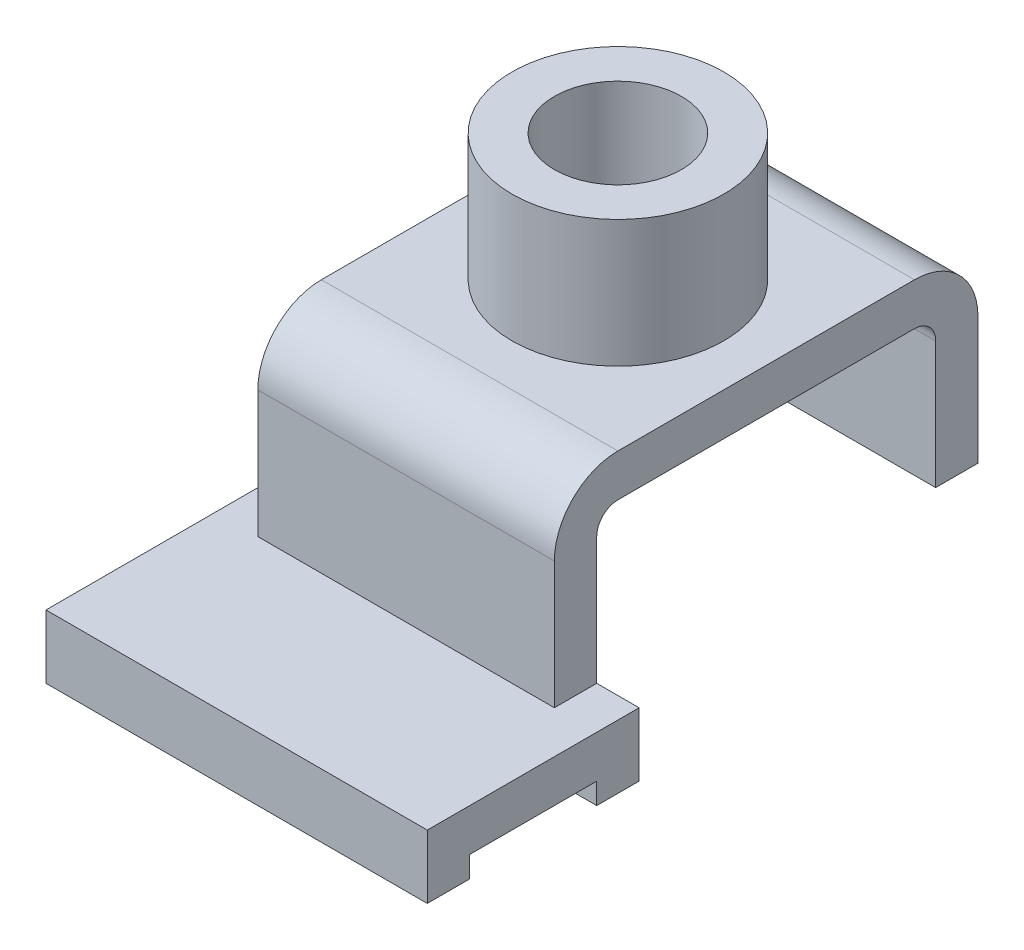
ISO-10303-21;
HEADER;
FILE_DESCRIPTION(('STEP AP214'),'2;1');
FILE_NAME('part.step','',(''),(''),'','','');
FILE_SCHEMA(('AUTOMOTIVE_DESIGN { 1 0 10303 214 1 1 1 1 }'));
ENDSEC;
DATA;
#1=APPLICATION_CONTEXT('core data for automotive mechanical design processes');
#2=APPLICATION_PROTOCOL_DEFINITION('international standard','automotive_design',2000,#1);
#3=PRODUCT_CONTEXT('',#1,'mechanical');
#4=PRODUCT('Part','Part','',(#3));
#5=PRODUCT_RELATED_PRODUCT_CATEGORY('part','',(#4));
#6=PRODUCT_DEFINITION_FORMATION('','',#4);
#7=PRODUCT_DEFINITION_CONTEXT('part definition',#1,'design');
#8=PRODUCT_DEFINITION('design','',#6,#7);
#9=PRODUCT_DEFINITION_SHAPE('','',#8);
#10=(LENGTH_UNIT() NAMED_UNIT(*) SI_UNIT(.MILLI.,.METRE.));
#11=(NAMED_UNIT(*) PLANE_ANGLE_UNIT() SI_UNIT($,.RADIAN.));
#12=(NAMED_UNIT(*) SI_UNIT($,.STERADIAN.) SOLID_ANGLE_UNIT());
#13=UNCERTAINTY_MEASURE_WITH_UNIT(LENGTH_MEASURE(1.E-05),#10,'distance_accuracy_value','');
#14=(GEOMETRIC_REPRESENTATION_CONTEXT(3) GLOBAL_UNCERTAINTY_ASSIGNED_CONTEXT((#13)) GLOBAL_UNIT_ASSIGNED_CONTEXT((#10,
#11,#12)) REPRESENTATION_CONTEXT('',''));
#15=CARTESIAN_POINT('',(0.,0.,0.));
#16=DIRECTION('',(0.,0.,1.));
#17=DIRECTION('',(1.,0.,0.));
#18=AXIS2_PLACEMENT_3D('',#15,#16,#17);
#19=CARTESIAN_POINT('',(-45.,8.35714285714285,30.6428571428572));
#20=DIRECTION('',(0.,1.,0.));
#21=DIRECTION('',(0.,0.,1.));
#22=AXIS2_PLACEMENT_3D('',#19,#20,#21);
#23=PLANE('',#22);
#24=DIRECTION('',(1.,0.,0.));
#25=VECTOR('',#24,1.);
#26=CARTESIAN_POINT('',(-35.,8.35714285714285,-9.35714285714283));
#27=LINE('',#26,#25);
#28=CARTESIAN_POINT('',(-35.,8.35714285714285,-9.35714285714283));
#29=VERTEX_POINT('',#28);
#30=CARTESIAN_POINT('',(35.,8.35714285714285,-9.35714285714283));
#31=VERTEX_POINT('',#30);
#32=EDGE_CURVE('E155',#29,#31,#27,.T.);
#33=ORIENTED_EDGE('',*,*,#32,.F.);
#34=DIRECTION('',(0.,0.,-1.));
#35=VECTOR('',#34,1.);
#36=CARTESIAN_POINT('',(-35.,8.35714285714285,-9.35714285714283));
#37=LINE('',#36,#35);
#38=CARTESIAN_POINT('',(-35.,8.35714285714285,-19.3571428571428));
#39=VERTEX_POINT('',#38);
#40=EDGE_CURVE('E298',#29,#39,#37,.T.);
#41=ORIENTED_EDGE('',*,*,#40,.T.);
#42=DIRECTION('',(1.,0.,0.));
#43=VECTOR('',#42,1.);
#44=CARTESIAN_POINT('',(-45.,8.35714285714285,-19.3571428571428));
#45=LINE('',#44,#43);
#46=CARTESIAN_POINT('',(-45.,8.35714285714285,-19.3571428571428));
#47=VERTEX_POINT('',#46);
#48=EDGE_CURVE('E131',#47,#39,#45,.T.);
#49=ORIENTED_EDGE('',*,*,#48,.F.);
#50=DIRECTION('',(0.,0.,1.));
#51=VECTOR('',#50,1.);
#52=CARTESIAN_POINT('',(-45.,8.35714285714285,30.6428571428572));
#53=LINE('',#52,#51);
#54=CARTESIAN_POINT('',(-45.,8.35714285714285,30.6428571428572));
#55=VERTEX_POINT('',#54);
#56=EDGE_CURVE('E137',#47,#55,#53,.T.);
#57=ORIENTED_EDGE('',*,*,#56,.T.);
#58=DIRECTION('',(1.,0.,0.));
#59=VECTOR('',#58,1.);
#60=CARTESIAN_POINT('',(-45.,8.35714285714285,30.6428571428572));
#61=LINE('',#60,#59);
#62=CARTESIAN_POINT('',(45.,8.35714285714285,30.6428571428572));
#63=VERTEX_POINT('',#62);
#64=EDGE_CURVE('E119',#55,#63,#61,.T.);
#65=ORIENTED_EDGE('',*,*,#64,.T.);
#66=DIRECTION('',(0.,0.,1.));
#67=VECTOR('',#66,1.);
#68=CARTESIAN_POINT('',(45.,8.35714285714285,30.6428571428572));
#69=LINE('',#68,#67);
#70=CARTESIAN_POINT('',(45.,8.35714285714285,-19.3571428571428));
#71=VERTEX_POINT('',#70);
#72=EDGE_CURVE('E167',#71,#63,#69,.T.);
#73=ORIENTED_EDGE('',*,*,#72,.F.);
#74=CARTESIAN_POINT('',(35.,8.35714285714285,-19.3571428571428));
#75=VERTEX_POINT('',#74);
#76=EDGE_CURVE('E177',#75,#71,#45,.T.);
#77=ORIENTED_EDGE('',*,*,#76,.F.);
#78=DIRECTION('',(0.,0.,-1.));
#79=VECTOR('',#78,1.);
#80=CARTESIAN_POINT('',(35.,8.35714285714285,-9.35714285714283));
#81=LINE('',#80,#79);
#82=EDGE_CURVE('E52',#31,#75,#81,.T.);
#83=ORIENTED_EDGE('',*,*,#82,.F.);
#84=EDGE_LOOP('',(#33,#41,#49,#57,#65,#73,#77,#83));
#85=FACE_BOUND('',#84,.T.);
#86=ADVANCED_FACE('F37',(#85),#23,.T.);
#87=CARTESIAN_POINT('',(-45.,-1.64285714285714,20.6428571428572));
#88=DIRECTION('',(0.,0.,-1.));
#89=DIRECTION('',(0.,1.,0.));
#90=AXIS2_PLACEMENT_3D('',#87,#88,#89);
#91=PLANE('',#90);
#92=DIRECTION('',(0.,1.,0.));
#93=VECTOR('',#92,1.);
#94=CARTESIAN_POINT('',(45.,-1.64285714285714,20.6428571428572));
#95=LINE('',#94,#93);
#96=CARTESIAN_POINT('',(45.,-6.64285714285714,20.6428571428572));
#97=VERTEX_POINT('',#96);
#98=CARTESIAN_POINT('',(45.,-1.64285714285714,20.6428571428572));
#99=VERTEX_POINT('',#98);
#100=EDGE_CURVE('E151',#97,#99,#95,.T.);
#101=ORIENTED_EDGE('',*,*,#100,.F.);
#102=DIRECTION('',(1.,0.,0.));
#103=VECTOR('',#102,1.);
#104=CARTESIAN_POINT('',(-45.,-6.64285714285714,20.6428571428572));
#105=LINE('',#104,#103);
#106=CARTESIAN_POINT('',(-45.,-6.64285714285714,20.6428571428572));
#107=VERTEX_POINT('',#106);
#108=EDGE_CURVE('E45',#107,#97,#105,.T.);
#109=ORIENTED_EDGE('',*,*,#108,.F.);
#110=DIRECTION('',(0.,1.,0.));
#111=VECTOR('',#110,1.);
#112=CARTESIAN_POINT('',(-45.,-1.64285714285714,20.6428571428572));
#113=LINE('',#112,#111);
#114=CARTESIAN_POINT('',(-45.,-1.64285714285714,20.6428571428572));
#115=VERTEX_POINT('',#114);
#116=EDGE_CURVE('E173',#107,#115,#113,.T.);
#117=ORIENTED_EDGE('',*,*,#116,.T.);
#118=DIRECTION('',(1.,0.,0.));
#119=VECTOR('',#118,1.);
#120=CARTESIAN_POINT('',(-45.,-1.64285714285714,20.6428571428572));
#121=LINE('',#120,#119);
#122=EDGE_CURVE('E99',#115,#99,#121,.T.);
#123=ORIENTED_EDGE('',*,*,#122,.T.);
#124=EDGE_LOOP('',(#101,#109,#117,#123));
#125=FACE_BOUND('',#124,.T.);
#126=ADVANCED_FACE('F39',(#125),#91,.T.);
#127=CARTESIAN_POINT('',(-45.,-6.64285714285714,20.6428571428572));
#128=DIRECTION('',(0.,-1.,0.));
#129=DIRECTION('',(0.,0.,-1.));
#130=AXIS2_PLACEMENT_3D('',#127,#128,#129);
#131=PLANE('',#130);
#132=DIRECTION('',(0.,0.,-1.));
#133=VECTOR('',#132,1.);
#134=CARTESIAN_POINT('',(45.,-6.64285714285714,20.6428571428572));
#135=LINE('',#134,#133);
#136=CARTESIAN_POINT('',(45.,-6.64285714285714,30.6428571428572));
#137=VERTEX_POINT('',#136);
#138=EDGE_CURVE('E170',#137,#97,#135,.T.);
#139=ORIENTED_EDGE('',*,*,#138,.F.);
#140=DIRECTION('',(1.,0.,0.));
#141=VECTOR('',#140,1.);
#142=CARTESIAN_POINT('',(-45.,-6.64285714285714,30.6428571428572));
#143=LINE('',#142,#141);
#144=CARTESIAN_POINT('',(-45.,-6.64285714285714,30.6428571428572));
#145=VERTEX_POINT('',#144);
#146=EDGE_CURVE('E130',#145,#137,#143,.T.);
#147=ORIENTED_EDGE('',*,*,#146,.F.);
#148=DIRECTION('',(0.,0.,-1.));
#149=VECTOR('',#148,1.);
#150=CARTESIAN_POINT('',(-45.,-6.64285714285714,20.6428571428572));
#151=LINE('',#150,#149);
#152=EDGE_CURVE('E139',#145,#107,#151,.T.);
#153=ORIENTED_EDGE('',*,*,#152,.T.);
#154=ORIENTED_EDGE('',*,*,#108,.T.);
#155=EDGE_LOOP('',(#139,#147,#153,#154));
#156=FACE_BOUND('',#155,.T.);
#157=ADVANCED_FACE('F187',(#156),#131,.T.);
#158=CARTESIAN_POINT('',(-45.,-6.64285714285714,30.6428571428572));
#159=DIRECTION('',(0.,0.,1.));
#160=DIRECTION('',(1.,0.,0.));
#161=AXIS2_PLACEMENT_3D('',#158,#159,#160);
#162=PLANE('',#161);
#163=DIRECTION('',(0.,-1.,0.));
#164=VECTOR('',#163,1.);
#165=CARTESIAN_POINT('',(45.,-6.64285714285714,30.6428571428572));
#166=LINE('',#165,#164);
#167=EDGE_CURVE('E125',#63,#137,#166,.T.);
#168=ORIENTED_EDGE('',*,*,#167,.F.);
#169=ORIENTED_EDGE('',*,*,#64,.F.);
#170=DIRECTION('',(0.,-1.,0.));
#171=VECTOR('',#170,1.);
#172=CARTESIAN_POINT('',(-45.,-6.64285714285714,30.6428571428572));
#173=LINE('',#172,#171);
#174=EDGE_CURVE('E122',#55,#145,#173,.T.);
#175=ORIENTED_EDGE('',*,*,#174,.T.);
#176=ORIENTED_EDGE('',*,*,#146,.T.);
#177=EDGE_LOOP('',(#168,#169,#175,#176));
#178=FACE_BOUND('',#177,.T.);
#179=ADVANCED_FACE('F121',(#178),#162,.T.);
#180=CARTESIAN_POINT('',(-45.,8.35714285714285,-19.3571428571428));
#181=DIRECTION('',(0.,0.,-1.));
#182=DIRECTION('',(0.,1.,0.));
#183=AXIS2_PLACEMENT_3D('',#180,#181,#182);
#184=PLANE('',#183);
#185=DIRECTION('',(0.,1.,0.));
#186=VECTOR('',#185,1.);
#187=CARTESIAN_POINT('',(45.,8.35714285714285,-19.3571428571428));
#188=LINE('',#187,#186);
#189=CARTESIAN_POINT('',(45.,-6.64285714285714,-19.3571428571428));
#190=VERTEX_POINT('',#189);
#191=EDGE_CURVE('E164',#190,#71,#188,.T.);
#192=ORIENTED_EDGE('',*,*,#191,.F.);
#193=DIRECTION('',(1.,0.,0.));
#194=VECTOR('',#193,1.);
#195=CARTESIAN_POINT('',(-45.,-6.64285714285714,-19.3571428571428));
#196=LINE('',#195,#194);
#197=CARTESIAN_POINT('',(-45.,-6.64285714285714,-19.3571428571428));
#198=VERTEX_POINT('',#197);
#199=EDGE_CURVE('E178',#198,#190,#196,.T.);
#200=ORIENTED_EDGE('',*,*,#199,.F.);
#201=DIRECTION('',(0.,1.,0.));
#202=VECTOR('',#201,1.);
#203=CARTESIAN_POINT('',(-45.,8.35714285714285,-19.3571428571428));
#204=LINE('',#203,#202);
#205=EDGE_CURVE('E144',#198,#47,#204,.T.);
#206=ORIENTED_EDGE('',*,*,#205,.T.);
#207=ORIENTED_EDGE('',*,*,#48,.T.);
#208=DIRECTION('',(0.,1.,0.));
#209=VECTOR('',#208,1.);
#210=CARTESIAN_POINT('',(-35.,8.35714285714285,-19.3571428571428));
#211=LINE('',#210,#209);
#212=CARTESIAN_POINT('',(-35.,38.3571428571429,-19.3571428571428));
#213=VERTEX_POINT('',#212);
#214=EDGE_CURVE('E300',#39,#213,#211,.T.);
#215=ORIENTED_EDGE('',*,*,#214,.T.);
#216=DIRECTION('',(1.,0.,0.));
#217=VECTOR('',#216,1.);
#218=CARTESIAN_POINT('',(-35.,38.3571428571429,-19.3571428571428));
#219=LINE('',#218,#217);
#220=CARTESIAN_POINT('',(35.,38.3571428571429,-19.3571428571428));
#221=VERTEX_POINT('',#220);
#222=EDGE_CURVE('E334',#213,#221,#219,.T.);
#223=ORIENTED_EDGE('',*,*,#222,.T.);
#224=DIRECTION('',(0.,1.,0.));
#225=VECTOR('',#224,1.);
#226=CARTESIAN_POINT('',(35.,8.35714285714285,-19.3571428571428));
#227=LINE('',#226,#225);
#228=EDGE_CURVE('E336',#75,#221,#227,.T.);
#229=ORIENTED_EDGE('',*,*,#228,.F.);
#230=ORIENTED_EDGE('',*,*,#76,.T.);
#231=EDGE_LOOP('',(#192,#200,#206,#207,#215,#223,#229,#230));
#232=FACE_BOUND('',#231,.T.);
#233=ADVANCED_FACE('F194',(#232),#184,.T.);
#234=CARTESIAN_POINT('',(-45.,-6.64285714285714,-19.3571428571428));
#235=DIRECTION('',(0.,-1.,0.));
#236=DIRECTION('',(0.,0.,-1.));
#237=AXIS2_PLACEMENT_3D('',#234,#235,#236);
#238=PLANE('',#237);
#239=DIRECTION('',(0.,0.,-1.));
#240=VECTOR('',#239,1.);
#241=CARTESIAN_POINT('',(45.,-6.64285714285714,-19.3571428571428));
#242=LINE('',#241,#240);
#243=CARTESIAN_POINT('',(45.,-6.64285714285714,-9.35714285714283));
#244=VERTEX_POINT('',#243);
#245=EDGE_CURVE('E161',#244,#190,#242,.T.);
#246=ORIENTED_EDGE('',*,*,#245,.F.);
#247=DIRECTION('',(1.,0.,0.));
#248=VECTOR('',#247,1.);
#249=CARTESIAN_POINT('',(-45.,-6.64285714285714,-9.35714285714283));
#250=LINE('',#249,#248);
#251=CARTESIAN_POINT('',(-45.,-6.64285714285714,-9.35714285714283));
#252=VERTEX_POINT('',#251);
#253=EDGE_CURVE('E180',#252,#244,#250,.T.);
#254=ORIENTED_EDGE('',*,*,#253,.F.);
#255=DIRECTION('',(0.,0.,-1.));
#256=VECTOR('',#255,1.);
#257=CARTESIAN_POINT('',(-45.,-6.64285714285714,-19.3571428571428));
#258=LINE('',#257,#256);
#259=EDGE_CURVE('E146',#252,#198,#258,.T.);
#260=ORIENTED_EDGE('',*,*,#259,.T.);
#261=ORIENTED_EDGE('',*,*,#199,.T.);
#262=EDGE_LOOP('',(#246,#254,#260,#261));
#263=FACE_BOUND('',#262,.T.);
#264=ADVANCED_FACE('F204',(#263),#238,.T.);
#265=CARTESIAN_POINT('',(-45.,-6.64285714285714,-9.35714285714283));
#266=DIRECTION('',(0.,0.,1.));
#267=DIRECTION('',(0.,-1.,0.));
#268=AXIS2_PLACEMENT_3D('',#265,#266,#267);
#269=PLANE('',#268);
#270=DIRECTION('',(0.,-1.,0.));
#271=VECTOR('',#270,1.);
#272=CARTESIAN_POINT('',(45.,-6.64285714285714,-9.35714285714283));
#273=LINE('',#272,#271);
#274=CARTESIAN_POINT('',(45.,-1.64285714285714,-9.35714285714282));
#275=VERTEX_POINT('',#274);
#276=EDGE_CURVE('E158',#275,#244,#273,.T.);
#277=ORIENTED_EDGE('',*,*,#276,.F.);
#278=DIRECTION('',(1.,0.,0.));
#279=VECTOR('',#278,1.);
#280=CARTESIAN_POINT('',(-45.,-1.64285714285714,-9.35714285714282));
#281=LINE('',#280,#279);
#282=CARTESIAN_POINT('',(-45.,-1.64285714285714,-9.35714285714282));
#283=VERTEX_POINT('',#282);
#284=EDGE_CURVE('E182',#283,#275,#281,.T.);
#285=ORIENTED_EDGE('',*,*,#284,.F.);
#286=DIRECTION('',(0.,-1.,0.));
#287=VECTOR('',#286,1.);
#288=CARTESIAN_POINT('',(-45.,-6.64285714285714,-9.35714285714283));
#289=LINE('',#288,#287);
#290=EDGE_CURVE('E400',#283,#252,#289,.T.);
#291=ORIENTED_EDGE('',*,*,#290,.T.);
#292=ORIENTED_EDGE('',*,*,#253,.T.);
#293=EDGE_LOOP('',(#277,#285,#291,#292));
#294=FACE_BOUND('',#293,.T.);
#295=ADVANCED_FACE('F208',(#294),#269,.T.);
#296=CARTESIAN_POINT('',(-45.,-1.64285714285714,-9.35714285714282));
#297=DIRECTION('',(0.,-1.,0.));
#298=DIRECTION('',(0.,0.,-1.));
#299=AXIS2_PLACEMENT_3D('',#296,#297,#298);
#300=PLANE('',#299);
#301=DIRECTION('',(0.,0.,-1.));
#302=VECTOR('',#301,1.);
#303=CARTESIAN_POINT('',(45.,-1.64285714285714,-9.35714285714282));
#304=LINE('',#303,#302);
#305=EDGE_CURVE('E154',#99,#275,#304,.T.);
#306=ORIENTED_EDGE('',*,*,#305,.F.);
#307=ORIENTED_EDGE('',*,*,#122,.F.);
#308=DIRECTION('',(0.,0.,-1.));
#309=VECTOR('',#308,1.);
#310=CARTESIAN_POINT('',(-45.,-1.64285714285714,-9.35714285714282));
#311=LINE('',#310,#309);
#312=EDGE_CURVE('E398',#115,#283,#311,.T.);
#313=ORIENTED_EDGE('',*,*,#312,.T.);
#314=ORIENTED_EDGE('',*,*,#284,.T.);
#315=EDGE_LOOP('',(#306,#307,#313,#314));
#316=FACE_BOUND('',#315,.T.);
#317=ADVANCED_FACE('F183',(#316),#300,.T.);
#318=CARTESIAN_POINT('',(-45.,0.,0.));
#319=DIRECTION('',(-1.,0.,0.));
#320=DIRECTION('',(0.,0.,1.));
#321=AXIS2_PLACEMENT_3D('',#318,#319,#320);
#322=PLANE('',#321);
#323=ORIENTED_EDGE('',*,*,#116,.F.);
#324=ORIENTED_EDGE('',*,*,#152,.F.);
#325=ORIENTED_EDGE('',*,*,#174,.F.);
#326=ORIENTED_EDGE('',*,*,#56,.F.);
#327=ORIENTED_EDGE('',*,*,#205,.F.);
#328=ORIENTED_EDGE('',*,*,#259,.F.);
#329=ORIENTED_EDGE('',*,*,#290,.F.);
#330=ORIENTED_EDGE('',*,*,#312,.F.);
#331=EDGE_LOOP('',(#323,#324,#325,#326,#327,#328,#329,#330));
#332=FACE_BOUND('',#331,.T.);
#333=ADVANCED_FACE('F135',(#332),#322,.T.);
#334=CARTESIAN_POINT('',(45.,0.,0.));
#335=DIRECTION('',(-1.,0.,0.));
#336=DIRECTION('',(0.,0.,1.));
#337=AXIS2_PLACEMENT_3D('',#334,#335,#336);
#338=PLANE('',#337);
#339=ORIENTED_EDGE('',*,*,#100,.T.);
#340=ORIENTED_EDGE('',*,*,#305,.T.);
#341=ORIENTED_EDGE('',*,*,#276,.T.);
#342=ORIENTED_EDGE('',*,*,#245,.T.);
#343=ORIENTED_EDGE('',*,*,#191,.T.);
#344=ORIENTED_EDGE('',*,*,#72,.T.);
#345=ORIENTED_EDGE('',*,*,#167,.T.);
#346=ORIENTED_EDGE('',*,*,#138,.T.);
#347=EDGE_LOOP('',(#339,#340,#341,#342,#343,#344,#345,#346));
#348=FACE_BOUND('',#347,.T.);
#349=ADVANCED_FACE('F186',(#348),#338,.F.);
#350=CARTESIAN_POINT('',(-35.,38.3571428571429,-9.35714285714282));
#351=DIRECTION('',(0.,0.,1.));
#352=DIRECTION('',(0.,-1.,0.));
#353=AXIS2_PLACEMENT_3D('',#350,#351,#352);
#354=PLANE('',#353);
#355=DIRECTION('',(0.,-1.,0.));
#356=VECTOR('',#355,1.);
#357=CARTESIAN_POINT('',(35.,38.3571428571429,-9.35714285714282));
#358=LINE('',#357,#356);
#359=CARTESIAN_POINT('',(35.,38.3571428571429,-9.35714285714282));
#360=VERTEX_POINT('',#359);
#361=EDGE_CURVE('E301',#360,#31,#358,.T.);
#362=ORIENTED_EDGE('',*,*,#361,.F.);
#363=DIRECTION('',(1.,0.,0.));
#364=VECTOR('',#363,1.);
#365=CARTESIAN_POINT('',(-35.,38.3571428571429,-9.35714285714282));
#366=LINE('',#365,#364);
#367=CARTESIAN_POINT('',(-35.,38.3571428571429,-9.35714285714282));
#368=VERTEX_POINT('',#367);
#369=EDGE_CURVE('E368',#368,#360,#366,.T.);
#370=ORIENTED_EDGE('',*,*,#369,.F.);
#371=DIRECTION('',(0.,-1.,0.));
#372=VECTOR('',#371,1.);
#373=CARTESIAN_POINT('',(-35.,38.3571428571429,-9.35714285714282));
#374=LINE('',#373,#372);
#375=EDGE_CURVE('E331',#368,#29,#374,.T.);
#376=ORIENTED_EDGE('',*,*,#375,.T.);
#377=ORIENTED_EDGE('',*,*,#32,.T.);
#378=EDGE_LOOP('',(#362,#370,#376,#377));
#379=FACE_BOUND('',#378,.T.);
#380=ADVANCED_FACE('F220',(#379),#354,.T.);
#381=CARTESIAN_POINT('',(-35.,38.3571428571429,-24.3571428571428));
#382=DIRECTION('',(1.,0.,0.));
#383=DIRECTION('',(0.,0.,-1.));
#384=AXIS2_PLACEMENT_3D('',#381,#382,#383);
#385=CYLINDRICAL_SURFACE('',#384,15.);
#386=CARTESIAN_POINT('',(35.,38.3571428571429,-24.3571428571428));
#387=DIRECTION('',(1.,0.,0.));
#388=DIRECTION('',(0.,0.,-1.));
#389=AXIS2_PLACEMENT_3D('',#386,#387,#388);
#390=CIRCLE('',#389,15.);
#391=CARTESIAN_POINT('',(35.,53.3571428571429,-24.3571428571428));
#392=VERTEX_POINT('',#391);
#393=EDGE_CURVE('E362',#392,#360,#390,.T.);
#394=ORIENTED_EDGE('',*,*,#393,.F.);
#395=DIRECTION('',(1.,0.,0.));
#396=VECTOR('',#395,1.);
#397=CARTESIAN_POINT('',(-35.,53.3571428571429,-24.3571428571428));
#398=LINE('',#397,#396);
#399=CARTESIAN_POINT('',(-35.,53.3571428571429,-24.3571428571428));
#400=VERTEX_POINT('',#399);
#401=EDGE_CURVE('E371',#400,#392,#398,.T.);
#402=ORIENTED_EDGE('',*,*,#401,.F.);
#403=CARTESIAN_POINT('',(-35.,38.3571428571429,-24.3571428571428));
#404=DIRECTION('',(1.,0.,0.));
#405=DIRECTION('',(0.,0.,-1.));
#406=AXIS2_PLACEMENT_3D('',#403,#404,#405);
#407=CIRCLE('',#406,15.);
#408=EDGE_CURVE('E328',#400,#368,#407,.T.);
#409=ORIENTED_EDGE('',*,*,#408,.T.);
#410=ORIENTED_EDGE('',*,*,#369,.T.);
#411=EDGE_LOOP('',(#394,#402,#409,#410));
#412=FACE_BOUND('',#411,.T.);
#413=ADVANCED_FACE('F254',(#412),#385,.T.);
#414=CARTESIAN_POINT('',(-35.,53.3571428571429,-94.3571428571428));
#415=DIRECTION('',(0.,1.,0.));
#416=DIRECTION('',(0.,0.,1.));
#417=AXIS2_PLACEMENT_3D('',#414,#415,#416);
#418=PLANE('',#417);
#419=CARTESIAN_POINT('',(0.,53.3571428571429,-59.3571428571428));
#420=DIRECTION('',(0.,1.,0.));
#421=DIRECTION('',(0.,0.,1.));
#422=AXIS2_PLACEMENT_3D('',#419,#420,#421);
#423=CIRCLE('',#422,25.);
#424=CARTESIAN_POINT('',(0.,53.3571428571429,-34.3571428571428));
#425=VERTEX_POINT('',#424);
#426=EDGE_CURVE('E290',#425,#425,#423,.T.);
#427=ORIENTED_EDGE('',*,*,#426,.F.);
#428=EDGE_LOOP('',(#427));
#429=FACE_BOUND('',#428,.T.);
#430=DIRECTION('',(0.,0.,1.));
#431=VECTOR('',#430,1.);
#432=CARTESIAN_POINT('',(35.,53.3571428571429,-94.3571428571428));
#433=LINE('',#432,#431);
#434=CARTESIAN_POINT('',(35.,53.3571428571429,-94.3571428571428));
#435=VERTEX_POINT('',#434);
#436=EDGE_CURVE('E359',#435,#392,#433,.T.);
#437=ORIENTED_EDGE('',*,*,#436,.F.);
#438=DIRECTION('',(1.,0.,0.));
#439=VECTOR('',#438,1.);
#440=CARTESIAN_POINT('',(-35.,53.3571428571429,-94.3571428571428));
#441=LINE('',#440,#439);
#442=CARTESIAN_POINT('',(-35.,53.3571428571429,-94.3571428571428));
#443=VERTEX_POINT('',#442);
#444=EDGE_CURVE('E374',#443,#435,#441,.T.);
#445=ORIENTED_EDGE('',*,*,#444,.F.);
#446=DIRECTION('',(0.,0.,1.));
#447=VECTOR('',#446,1.);
#448=CARTESIAN_POINT('',(-35.,53.3571428571429,-94.3571428571428));
#449=LINE('',#448,#447);
#450=EDGE_CURVE('E325',#443,#400,#449,.T.);
#451=ORIENTED_EDGE('',*,*,#450,.T.);
#452=ORIENTED_EDGE('',*,*,#401,.T.);
#453=EDGE_LOOP('',(#437,#445,#451,#452));
#454=FACE_BOUND('',#453,.T.);
#455=ADVANCED_FACE('F250',(#429,#454),#418,.T.);
#456=CARTESIAN_POINT('',(-35.,38.3571428571429,-94.3571428571428));
#457=DIRECTION('',(1.,0.,0.));
#458=DIRECTION('',(0.,0.,-1.));
#459=AXIS2_PLACEMENT_3D('',#456,#457,#458);
#460=CYLINDRICAL_SURFACE('',#459,15.);
#461=CARTESIAN_POINT('',(35.,38.3571428571429,-94.3571428571428));
#462=DIRECTION('',(1.,0.,0.));
#463=DIRECTION('',(0.,0.,-1.));
#464=AXIS2_PLACEMENT_3D('',#461,#462,#463);
#465=CIRCLE('',#464,15.);
#466=CARTESIAN_POINT('',(35.,38.3571428571429,-109.357142857143));
#467=VERTEX_POINT('',#466);
#468=EDGE_CURVE('E356',#467,#435,#465,.T.);
#469=ORIENTED_EDGE('',*,*,#468,.F.);
#470=DIRECTION('',(1.,0.,0.));
#471=VECTOR('',#470,1.);
#472=CARTESIAN_POINT('',(-35.,38.3571428571429,-109.357142857143));
#473=LINE('',#472,#471);
#474=CARTESIAN_POINT('',(-35.,38.3571428571429,-109.357142857143));
#475=VERTEX_POINT('',#474);
#476=EDGE_CURVE('E377',#475,#467,#473,.T.);
#477=ORIENTED_EDGE('',*,*,#476,.F.);
#478=CARTESIAN_POINT('',(-35.,38.3571428571429,-94.3571428571428));
#479=DIRECTION('',(1.,0.,0.));
#480=DIRECTION('',(0.,0.,-1.));
#481=AXIS2_PLACEMENT_3D('',#478,#479,#480);
#482=CIRCLE('',#481,15.);
#483=EDGE_CURVE('E322',#475,#443,#482,.T.);
#484=ORIENTED_EDGE('',*,*,#483,.T.);
#485=ORIENTED_EDGE('',*,*,#444,.T.);
#486=EDGE_LOOP('',(#469,#477,#484,#485));
#487=FACE_BOUND('',#486,.T.);
#488=ADVANCED_FACE('F246',(#487),#460,.T.);
#489=CARTESIAN_POINT('',(-35.,8.35714285714285,-109.357142857143));
#490=DIRECTION('',(0.,0.,-1.));
#491=DIRECTION('',(-1.,0.,0.));
#492=AXIS2_PLACEMENT_3D('',#489,#490,#491);
#493=PLANE('',#492);
#494=DIRECTION('',(0.,1.,0.));
#495=VECTOR('',#494,1.);
#496=CARTESIAN_POINT('',(35.,8.35714285714285,-109.357142857143));
#497=LINE('',#496,#495);
#498=CARTESIAN_POINT('',(35.,8.35714285714285,-109.357142857143));
#499=VERTEX_POINT('',#498);
#500=EDGE_CURVE('E353',#499,#467,#497,.T.);
#501=ORIENTED_EDGE('',*,*,#500,.F.);
#502=DIRECTION('',(1.,0.,0.));
#503=VECTOR('',#502,1.);
#504=CARTESIAN_POINT('',(-35.,8.35714285714285,-109.357142857143));
#505=LINE('',#504,#503);
#506=CARTESIAN_POINT('',(-35.,8.35714285714285,-109.357142857143));
#507=VERTEX_POINT('',#506);
#508=EDGE_CURVE('E380',#507,#499,#505,.T.);
#509=ORIENTED_EDGE('',*,*,#508,.F.);
#510=DIRECTION('',(0.,1.,0.));
#511=VECTOR('',#510,1.);
#512=CARTESIAN_POINT('',(-35.,8.35714285714285,-109.357142857143));
#513=LINE('',#512,#511);
#514=EDGE_CURVE('E319',#507,#475,#513,.T.);
#515=ORIENTED_EDGE('',*,*,#514,.T.);
#516=ORIENTED_EDGE('',*,*,#476,.T.);
#517=EDGE_LOOP('',(#501,#509,#515,#516));
#518=FACE_BOUND('',#517,.T.);
#519=ADVANCED_FACE('F242',(#518),#493,.T.);
#520=CARTESIAN_POINT('',(-35.,8.35714285714285,-99.3571428571428));
#521=DIRECTION('',(0.,-1.,0.));
#522=DIRECTION('',(0.,0.,-1.));
#523=AXIS2_PLACEMENT_3D('',#520,#521,#522);
#524=PLANE('',#523);
#525=DIRECTION('',(0.,0.,-1.));
#526=VECTOR('',#525,1.);
#527=CARTESIAN_POINT('',(35.,8.35714285714285,-99.3571428571428));
#528=LINE('',#527,#526);
#529=CARTESIAN_POINT('',(35.,8.35714285714285,-99.3571428571428));
#530=VERTEX_POINT('',#529);
#531=EDGE_CURVE('E350',#530,#499,#528,.T.);
#532=ORIENTED_EDGE('',*,*,#531,.F.);
#533=DIRECTION('',(1.,0.,0.));
#534=VECTOR('',#533,1.);
#535=CARTESIAN_POINT('',(-35.,8.35714285714285,-99.3571428571428));
#536=LINE('',#535,#534);
#537=CARTESIAN_POINT('',(-35.,8.35714285714285,-99.3571428571428));
#538=VERTEX_POINT('',#537);
#539=EDGE_CURVE('E383',#538,#530,#536,.T.);
#540=ORIENTED_EDGE('',*,*,#539,.F.);
#541=DIRECTION('',(0.,0.,-1.));
#542=VECTOR('',#541,1.);
#543=CARTESIAN_POINT('',(-35.,8.35714285714285,-99.3571428571428));
#544=LINE('',#543,#542);
#545=EDGE_CURVE('E316',#538,#507,#544,.T.);
#546=ORIENTED_EDGE('',*,*,#545,.T.);
#547=ORIENTED_EDGE('',*,*,#508,.T.);
#548=EDGE_LOOP('',(#532,#540,#546,#547));
#549=FACE_BOUND('',#548,.T.);
#550=ADVANCED_FACE('F238',(#549),#524,.T.);
#551=CARTESIAN_POINT('',(-35.,38.3571428571429,-99.3571428571428));
#552=DIRECTION('',(0.,0.,1.));
#553=DIRECTION('',(0.,-1.,0.));
#554=AXIS2_PLACEMENT_3D('',#551,#552,#553);
#555=PLANE('',#554);
#556=DIRECTION('',(0.,-1.,0.));
#557=VECTOR('',#556,1.);
#558=CARTESIAN_POINT('',(35.,38.3571428571429,-99.3571428571428));
#559=LINE('',#558,#557);
#560=CARTESIAN_POINT('',(35.,38.3571428571429,-99.3571428571428));
#561=VERTEX_POINT('',#560);
#562=EDGE_CURVE('E347',#561,#530,#559,.T.);
#563=ORIENTED_EDGE('',*,*,#562,.F.);
#564=DIRECTION('',(1.,0.,0.));
#565=VECTOR('',#564,1.);
#566=CARTESIAN_POINT('',(-35.,38.3571428571429,-99.3571428571428));
#567=LINE('',#566,#565);
#568=CARTESIAN_POINT('',(-35.,38.3571428571429,-99.3571428571428));
#569=VERTEX_POINT('',#568);
#570=EDGE_CURVE('E386',#569,#561,#567,.T.);
#571=ORIENTED_EDGE('',*,*,#570,.F.);
#572=DIRECTION('',(0.,-1.,0.));
#573=VECTOR('',#572,1.);
#574=CARTESIAN_POINT('',(-35.,38.3571428571429,-99.3571428571428));
#575=LINE('',#574,#573);
#576=EDGE_CURVE('E313',#569,#538,#575,.T.);
#577=ORIENTED_EDGE('',*,*,#576,.T.);
#578=ORIENTED_EDGE('',*,*,#539,.T.);
#579=EDGE_LOOP('',(#563,#571,#577,#578));
#580=FACE_BOUND('',#579,.T.);
#581=ADVANCED_FACE('F234',(#580),#555,.T.);
#582=CARTESIAN_POINT('',(-35.,38.3571428571429,-94.3571428571428));
#583=DIRECTION('',(1.,0.,0.));
#584=DIRECTION('',(0.,0.,-1.));
#585=AXIS2_PLACEMENT_3D('',#582,#583,#584);
#586=CYLINDRICAL_SURFACE('',#585,5.);
#587=CARTESIAN_POINT('',(35.,38.3571428571429,-94.3571428571428));
#588=DIRECTION('',(-1.,0.,0.));
#589=DIRECTION('',(0.,0.,-1.));
#590=AXIS2_PLACEMENT_3D('',#587,#588,#589);
#591=CIRCLE('',#590,5.);
#592=CARTESIAN_POINT('',(35.,43.3571428571429,-94.3571428571428));
#593=VERTEX_POINT('',#592);
#594=EDGE_CURVE('E344',#593,#561,#591,.T.);
#595=ORIENTED_EDGE('',*,*,#594,.F.);
#596=DIRECTION('',(1.,0.,0.));
#597=VECTOR('',#596,1.);
#598=CARTESIAN_POINT('',(-35.,43.3571428571429,-94.3571428571428));
#599=LINE('',#598,#597);
#600=CARTESIAN_POINT('',(-35.,43.3571428571429,-94.3571428571428));
#601=VERTEX_POINT('',#600);
#602=EDGE_CURVE('E389',#601,#593,#599,.T.);
#603=ORIENTED_EDGE('',*,*,#602,.F.);
#604=CARTESIAN_POINT('',(-35.,38.3571428571429,-94.3571428571428));
#605=DIRECTION('',(-1.,0.,0.));
#606=DIRECTION('',(0.,0.,-1.));
#607=AXIS2_PLACEMENT_3D('',#604,#605,#606);
#608=CIRCLE('',#607,5.);
#609=EDGE_CURVE('E310',#601,#569,#608,.T.);
#610=ORIENTED_EDGE('',*,*,#609,.T.);
#611=ORIENTED_EDGE('',*,*,#570,.T.);
#612=EDGE_LOOP('',(#595,#603,#610,#611));
#613=FACE_BOUND('',#612,.T.);
#614=ADVANCED_FACE('F230',(#613),#586,.F.);
#615=CARTESIAN_POINT('',(-35.,43.3571428571429,-24.3571428571428));
#616=DIRECTION('',(0.,-1.,0.));
#617=DIRECTION('',(0.,0.,-1.));
#618=AXIS2_PLACEMENT_3D('',#615,#616,#617);
#619=PLANE('',#618);
#620=DIRECTION('',(0.,0.,-1.));
#621=VECTOR('',#620,1.);
#622=CARTESIAN_POINT('',(35.,43.3571428571429,-24.3571428571428));
#623=LINE('',#622,#621);
#624=CARTESIAN_POINT('',(35.,43.3571428571429,-24.3571428571428));
#625=VERTEX_POINT('',#624);
#626=EDGE_CURVE('E341',#625,#593,#623,.T.);
#627=ORIENTED_EDGE('',*,*,#626,.F.);
#628=DIRECTION('',(1.,0.,0.));
#629=VECTOR('',#628,1.);
#630=CARTESIAN_POINT('',(-35.,43.3571428571429,-24.3571428571428));
#631=LINE('',#630,#629);
#632=CARTESIAN_POINT('',(-35.,43.3571428571429,-24.3571428571428));
#633=VERTEX_POINT('',#632);
#634=EDGE_CURVE('E392',#633,#625,#631,.T.);
#635=ORIENTED_EDGE('',*,*,#634,.F.);
#636=DIRECTION('',(0.,0.,-1.));
#637=VECTOR('',#636,1.);
#638=CARTESIAN_POINT('',(-35.,43.3571428571429,-24.3571428571428));
#639=LINE('',#638,#637);
#640=EDGE_CURVE('E307',#633,#601,#639,.T.);
#641=ORIENTED_EDGE('',*,*,#640,.T.);
#642=ORIENTED_EDGE('',*,*,#602,.T.);
#643=EDGE_LOOP('',(#627,#635,#641,#642));
#644=FACE_BOUND('',#643,.T.);
#645=ADVANCED_FACE('F226',(#644),#619,.T.);
#646=CARTESIAN_POINT('',(-35.,38.3571428571429,-24.3571428571428));
#647=DIRECTION('',(1.,0.,0.));
#648=DIRECTION('',(0.,0.,-1.));
#649=AXIS2_PLACEMENT_3D('',#646,#647,#648);
#650=CYLINDRICAL_SURFACE('',#649,5.);
#651=CARTESIAN_POINT('',(35.,38.3571428571429,-24.3571428571428));
#652=DIRECTION('',(-1.,0.,0.));
#653=DIRECTION('',(0.,0.,-1.));
#654=AXIS2_PLACEMENT_3D('',#651,#652,#653);
#655=CIRCLE('',#654,5.);
#656=EDGE_CURVE('E338',#221,#625,#655,.T.);
#657=ORIENTED_EDGE('',*,*,#656,.F.);
#658=ORIENTED_EDGE('',*,*,#222,.F.);
#659=CARTESIAN_POINT('',(-35.,38.3571428571429,-24.3571428571428));
#660=DIRECTION('',(-1.,0.,0.));
#661=DIRECTION('',(0.,0.,-1.));
#662=AXIS2_PLACEMENT_3D('',#659,#660,#661);
#663=CIRCLE('',#662,5.);
#664=EDGE_CURVE('E304',#213,#633,#663,.T.);
#665=ORIENTED_EDGE('',*,*,#664,.T.);
#666=ORIENTED_EDGE('',*,*,#634,.T.);
#667=EDGE_LOOP('',(#657,#658,#665,#666));
#668=FACE_BOUND('',#667,.T.);
#669=ADVANCED_FACE('F222',(#668),#650,.F.);
#670=CARTESIAN_POINT('',(-35.,38.3571428571429,-24.3571428571428));
#671=DIRECTION('',(1.,0.,0.));
#672=DIRECTION('',(0.,0.,-1.));
#673=AXIS2_PLACEMENT_3D('',#670,#671,#672);
#674=PLANE('',#673);
#675=ORIENTED_EDGE('',*,*,#40,.F.);
#676=ORIENTED_EDGE('',*,*,#375,.F.);
#677=ORIENTED_EDGE('',*,*,#408,.F.);
#678=ORIENTED_EDGE('',*,*,#450,.F.);
#679=ORIENTED_EDGE('',*,*,#483,.F.);
#680=ORIENTED_EDGE('',*,*,#514,.F.);
#681=ORIENTED_EDGE('',*,*,#545,.F.);
#682=ORIENTED_EDGE('',*,*,#576,.F.);
#683=ORIENTED_EDGE('',*,*,#609,.F.);
#684=ORIENTED_EDGE('',*,*,#640,.F.);
#685=ORIENTED_EDGE('',*,*,#664,.F.);
#686=ORIENTED_EDGE('',*,*,#214,.F.);
#687=EDGE_LOOP('',(#675,#676,#677,#678,#679,#680,#681,#682,#683,#684,#685,#686));
#688=FACE_BOUND('',#687,.T.);
#689=ADVANCED_FACE('F225',(#688),#674,.F.);
#690=CARTESIAN_POINT('',(35.,38.3571428571429,-24.3571428571428));
#691=DIRECTION('',(1.,0.,0.));
#692=DIRECTION('',(0.,0.,-1.));
#693=AXIS2_PLACEMENT_3D('',#690,#691,#692);
#694=PLANE('',#693);
#695=ORIENTED_EDGE('',*,*,#82,.T.);
#696=ORIENTED_EDGE('',*,*,#228,.T.);
#697=ORIENTED_EDGE('',*,*,#656,.T.);
#698=ORIENTED_EDGE('',*,*,#626,.T.);
#699=ORIENTED_EDGE('',*,*,#594,.T.);
#700=ORIENTED_EDGE('',*,*,#562,.T.);
#701=ORIENTED_EDGE('',*,*,#531,.T.);
#702=ORIENTED_EDGE('',*,*,#500,.T.);
#703=ORIENTED_EDGE('',*,*,#468,.T.);
#704=ORIENTED_EDGE('',*,*,#436,.T.);
#705=ORIENTED_EDGE('',*,*,#393,.T.);
#706=ORIENTED_EDGE('',*,*,#361,.T.);
#707=EDGE_LOOP('',(#695,#696,#697,#698,#699,#700,#701,#702,#703,#704,#705,#706));
#708=FACE_BOUND('',#707,.T.);
#709=ADVANCED_FACE('F263',(#708),#694,.T.);
#710=CARTESIAN_POINT('',(0.,83.3571428571429,-59.3571428571428));
#711=DIRECTION('',(0.,1.,0.));
#712=DIRECTION('',(0.,0.,1.));
#713=AXIS2_PLACEMENT_3D('',#710,#711,#712);
#714=PLANE('',#713);
#715=CARTESIAN_POINT('',(0.,83.3571428571429,-59.3571428571428));
#716=DIRECTION('',(0.,1.,0.));
#717=DIRECTION('',(0.,0.,1.));
#718=AXIS2_PLACEMENT_3D('',#715,#716,#717);
#719=CIRCLE('',#718,25.);
#720=CARTESIAN_POINT('',(0.,83.3571428571429,-34.3571428571428));
#721=VERTEX_POINT('',#720);
#722=EDGE_CURVE('E293',#721,#721,#719,.T.);
#723=ORIENTED_EDGE('',*,*,#722,.T.);
#724=EDGE_LOOP('',(#723));
#725=FACE_BOUND('',#724,.T.);
#726=CARTESIAN_POINT('',(0.,83.3571428571429,-59.3571428571428));
#727=DIRECTION('',(0.,1.,0.));
#728=DIRECTION('',(0.,0.,1.));
#729=AXIS2_PLACEMENT_3D('',#726,#727,#728);
#730=CIRCLE('',#729,15.);
#731=CARTESIAN_POINT('',(0.,83.3571428571429,-44.3571428571428));
#732=VERTEX_POINT('',#731);
#733=EDGE_CURVE('E287',#732,#732,#730,.T.);
#734=ORIENTED_EDGE('',*,*,#733,.F.);
#735=EDGE_LOOP('',(#734));
#736=FACE_BOUND('',#735,.T.);
#737=ADVANCED_FACE('F266',(#725,#736),#714,.T.);
#738=CARTESIAN_POINT('',(0.,83.3571428571429,-59.3571428571428));
#739=DIRECTION('',(0.,-1.,0.));
#740=DIRECTION('',(0.,0.,-1.));
#741=AXIS2_PLACEMENT_3D('',#738,#739,#740);
#742=CYLINDRICAL_SURFACE('',#741,25.);
#743=ORIENTED_EDGE('',*,*,#722,.F.);
#744=EDGE_LOOP('',(#743));
#745=FACE_BOUND('',#744,.T.);
#746=ORIENTED_EDGE('',*,*,#426,.T.);
#747=EDGE_LOOP('',(#746));
#748=FACE_BOUND('',#747,.T.);
#749=ADVANCED_FACE('F270',(#745,#748),#742,.T.);
#750=CARTESIAN_POINT('',(0.,83.3571428571429,-59.3571428571428));
#751=DIRECTION('',(0.,-1.,0.));
#752=DIRECTION('',(0.,0.,-1.));
#753=AXIS2_PLACEMENT_3D('',#750,#751,#752);
#754=CYLINDRICAL_SURFACE('',#753,15.);
#755=ORIENTED_EDGE('',*,*,#733,.T.);
#756=EDGE_LOOP('',(#755));
#757=FACE_BOUND('',#756,.T.);
#758=CARTESIAN_POINT('',(0.,53.3571428571429,-59.3571428571428));
#759=DIRECTION('',(0.,1.,0.));
#760=DIRECTION('',(0.,0.,1.));
#761=AXIS2_PLACEMENT_3D('',#758,#759,#760);
#762=CIRCLE('',#761,15.);
#763=CARTESIAN_POINT('',(0.,53.3571428571429,-44.3571428571428));
#764=VERTEX_POINT('',#763);
#765=EDGE_CURVE('E11',#764,#764,#762,.F.);
#766=ORIENTED_EDGE('',*,*,#765,.T.);
#767=EDGE_LOOP('',(#766));
#768=FACE_BOUND('',#767,.T.);
#769=ADVANCED_FACE('F273',(#757,#768),#754,.F.);
#770=ORIENTED_EDGE('',*,*,#765,.F.);
#771=EDGE_LOOP('',(#770));
#772=FACE_BOUND('',#771,.T.);
#773=ADVANCED_FACE('F256',(#772),#418,.T.);
#774=CLOSED_SHELL('',(#86,#126,#157,#179,#233,#264,#295,#317,#333,#349,#380,#413,#455,#488,#519,
#550,#581,#614,#645,#669,#689,#709,#737,#749,#769,#773));
#775=MANIFOLD_SOLID_BREP('B2',#774);
#776=ADVANCED_BREP_SHAPE_REPRESENTATION('',(#18,#775),#14);
#777=SHAPE_DEFINITION_REPRESENTATION(#9,#776);
ENDSEC;
END-ISO-10303-21;
